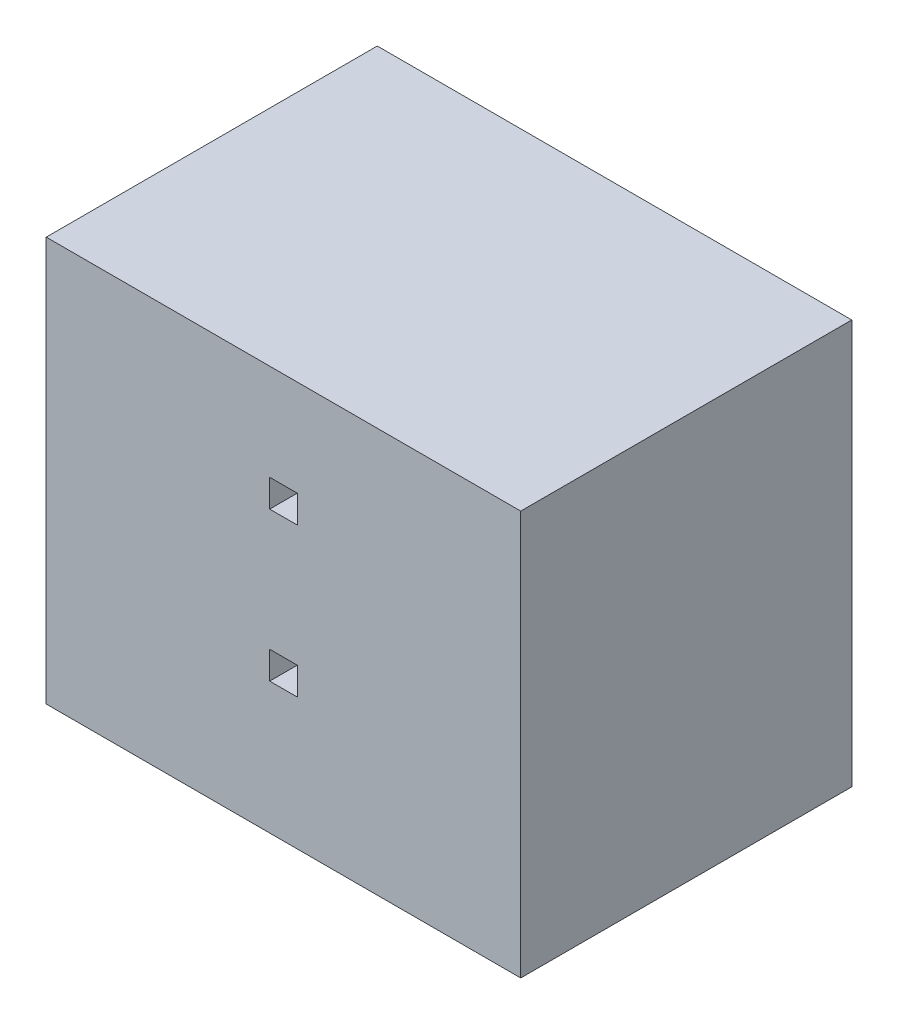
ISO-10303-21;
HEADER;
FILE_DESCRIPTION(('STEP AP214'),'2;1');
FILE_NAME('part.step','',(''),(''),'','','');
FILE_SCHEMA(('AUTOMOTIVE_DESIGN { 1 0 10303 214 1 1 1 1 }'));
ENDSEC;
DATA;
#1=APPLICATION_CONTEXT('core data for automotive mechanical design processes');
#2=APPLICATION_PROTOCOL_DEFINITION('international standard','automotive_design',2000,#1);
#3=PRODUCT_CONTEXT('',#1,'mechanical');
#4=PRODUCT('Part','Part','',(#3));
#5=PRODUCT_RELATED_PRODUCT_CATEGORY('part','',(#4));
#6=PRODUCT_DEFINITION_FORMATION('','',#4);
#7=PRODUCT_DEFINITION_CONTEXT('part definition',#1,'design');
#8=PRODUCT_DEFINITION('design','',#6,#7);
#9=PRODUCT_DEFINITION_SHAPE('','',#8);
#10=(LENGTH_UNIT() NAMED_UNIT(*) SI_UNIT(.MILLI.,.METRE.));
#11=(NAMED_UNIT(*) PLANE_ANGLE_UNIT() SI_UNIT($,.RADIAN.));
#12=(NAMED_UNIT(*) SI_UNIT($,.STERADIAN.) SOLID_ANGLE_UNIT());
#13=UNCERTAINTY_MEASURE_WITH_UNIT(LENGTH_MEASURE(1.E-05),#10,'distance_accuracy_value','');
#14=(GEOMETRIC_REPRESENTATION_CONTEXT(3) GLOBAL_UNCERTAINTY_ASSIGNED_CONTEXT((#13)) GLOBAL_UNIT_ASSIGNED_CONTEXT((#10,
#11,#12)) REPRESENTATION_CONTEXT('',''));
#15=CARTESIAN_POINT('',(0.,0.,0.));
#16=DIRECTION('',(0.,0.,1.));
#17=DIRECTION('',(1.,0.,0.));
#18=AXIS2_PLACEMENT_3D('',#15,#16,#17);
#19=CARTESIAN_POINT('',(0.,0.,200.));
#20=DIRECTION('',(0.,0.,1.));
#21=DIRECTION('',(1.,0.,0.));
#22=AXIS2_PLACEMENT_3D('',#19,#20,#21);
#23=PLANE('',#22);
#24=DIRECTION('',(-1.,0.,0.));
#25=VECTOR('',#24,1.);
#26=CARTESIAN_POINT('',(0.,14.,200.));
#27=LINE('',#26,#25);
#28=CARTESIAN_POINT('',(2.5,14.,200.));
#29=VERTEX_POINT('',#28);
#30=CARTESIAN_POINT('',(-2.5,14.,200.));
#31=VERTEX_POINT('',#30);
#32=EDGE_CURVE('E245',#29,#31,#27,.T.);
#33=ORIENTED_EDGE('',*,*,#32,.T.);
#34=DIRECTION('',(0.,-1.,0.));
#35=VECTOR('',#34,1.);
#36=CARTESIAN_POINT('',(-2.5,0.,200.));
#37=LINE('',#36,#35);
#38=CARTESIAN_POINT('',(-2.5,9.,200.));
#39=VERTEX_POINT('',#38);
#40=EDGE_CURVE('E249',#31,#39,#37,.T.);
#41=ORIENTED_EDGE('',*,*,#40,.T.);
#42=DIRECTION('',(1.,0.,0.));
#43=VECTOR('',#42,1.);
#44=CARTESIAN_POINT('',(0.,9.,200.));
#45=LINE('',#44,#43);
#46=CARTESIAN_POINT('',(2.5,9.,200.));
#47=VERTEX_POINT('',#46);
#48=EDGE_CURVE('E240',#39,#47,#45,.T.);
#49=ORIENTED_EDGE('',*,*,#48,.T.);
#50=DIRECTION('',(0.,1.,0.));
#51=VECTOR('',#50,1.);
#52=CARTESIAN_POINT('',(2.5,0.,200.));
#53=LINE('',#52,#51);
#54=EDGE_CURVE('E165',#47,#29,#53,.T.);
#55=ORIENTED_EDGE('',*,*,#54,.T.);
#56=EDGE_LOOP('',(#33,#41,#49,#55));
#57=FACE_BOUND('',#56,.T.);
#58=DIRECTION('',(1.,0.,0.));
#59=VECTOR('',#58,1.);
#60=CARTESIAN_POINT('',(0.,-18.,200.));
#61=LINE('',#60,#59);
#62=CARTESIAN_POINT('',(-2.5,-18.,200.));
#63=VERTEX_POINT('',#62);
#64=CARTESIAN_POINT('',(2.5,-18.,200.));
#65=VERTEX_POINT('',#64);
#66=EDGE_CURVE('E232',#63,#65,#61,.T.);
#67=ORIENTED_EDGE('',*,*,#66,.T.);
#68=DIRECTION('',(0.,1.,0.));
#69=VECTOR('',#68,1.);
#70=CARTESIAN_POINT('',(2.5,0.,200.));
#71=LINE('',#70,#69);
#72=CARTESIAN_POINT('',(2.5,-13.,200.));
#73=VERTEX_POINT('',#72);
#74=EDGE_CURVE('E236',#65,#73,#71,.T.);
#75=ORIENTED_EDGE('',*,*,#74,.T.);
#76=DIRECTION('',(-1.,0.,0.));
#77=VECTOR('',#76,1.);
#78=CARTESIAN_POINT('',(0.,-13.,200.));
#79=LINE('',#78,#77);
#80=CARTESIAN_POINT('',(-2.5,-13.,200.));
#81=VERTEX_POINT('',#80);
#82=EDGE_CURVE('E194',#73,#81,#79,.T.);
#83=ORIENTED_EDGE('',*,*,#82,.T.);
#84=DIRECTION('',(0.,-1.,0.));
#85=VECTOR('',#84,1.);
#86=CARTESIAN_POINT('',(-2.5,0.,200.));
#87=LINE('',#86,#85);
#88=EDGE_CURVE('E228',#81,#63,#87,.T.);
#89=ORIENTED_EDGE('',*,*,#88,.T.);
#90=EDGE_LOOP('',(#67,#75,#83,#89));
#91=FACE_BOUND('',#90,.T.);
#92=DIRECTION('',(0.,1.,0.));
#93=VECTOR('',#92,1.);
#94=CARTESIAN_POINT('',(-38.,26.4407661527358,200.));
#95=LINE('',#94,#93);
#96=CARTESIAN_POINT('',(-38.,-36.8493069972775,200.));
#97=VERTEX_POINT('',#96);
#98=CARTESIAN_POINT('',(-38.,26.4407661527358,200.));
#99=VERTEX_POINT('',#98);
#100=EDGE_CURVE('E330',#97,#99,#95,.T.);
#101=ORIENTED_EDGE('',*,*,#100,.T.);
#102=DIRECTION('',(1.,0.,0.));
#103=VECTOR('',#102,1.);
#104=CARTESIAN_POINT('',(-35.8835144409682,26.4407661527358,200.));
#105=LINE('',#104,#103);
#106=CARTESIAN_POINT('',(38.,26.4407661527358,200.));
#107=VERTEX_POINT('',#106);
#108=EDGE_CURVE('E11',#99,#107,#105,.T.);
#109=ORIENTED_EDGE('',*,*,#108,.T.);
#110=DIRECTION('',(0.,-1.,0.));
#111=VECTOR('',#110,1.);
#112=CARTESIAN_POINT('',(38.,-36.8493069972775,200.));
#113=LINE('',#112,#111);
#114=CARTESIAN_POINT('',(38.,-36.8493069972776,200.));
#115=VERTEX_POINT('',#114);
#116=EDGE_CURVE('E48',#107,#115,#113,.T.);
#117=ORIENTED_EDGE('',*,*,#116,.T.);
#118=DIRECTION('',(-1.,0.,0.));
#119=VECTOR('',#118,1.);
#120=CARTESIAN_POINT('',(-35.8835144409682,-36.8493069972775,200.));
#121=LINE('',#120,#119);
#122=EDGE_CURVE('E54',#115,#97,#121,.T.);
#123=ORIENTED_EDGE('',*,*,#122,.T.);
#124=EDGE_LOOP('',(#101,#109,#117,#123));
#125=FACE_BOUND('',#124,.T.);
#126=ADVANCED_FACE('F45',(#57,#91,#125),#23,.F.);
#127=CARTESIAN_POINT('',(-38.,26.4407661527358,160.));
#128=DIRECTION('',(-1.,0.,0.));
#129=DIRECTION('',(0.,0.,1.));
#130=AXIS2_PLACEMENT_3D('',#127,#128,#129);
#131=PLANE('',#130);
#132=DIRECTION('',(0.,0.,1.));
#133=VECTOR('',#132,1.);
#134=CARTESIAN_POINT('',(-38.,26.4407661527358,160.));
#135=LINE('',#134,#133);
#136=CARTESIAN_POINT('',(-38.,26.4407661527358,160.));
#137=VERTEX_POINT('',#136);
#138=EDGE_CURVE('E270',#137,#99,#135,.T.);
#139=ORIENTED_EDGE('',*,*,#138,.T.);
#140=ORIENTED_EDGE('',*,*,#100,.F.);
#141=DIRECTION('',(0.,0.,1.));
#142=VECTOR('',#141,1.);
#143=CARTESIAN_POINT('',(-38.,-36.8493069972776,160.));
#144=LINE('',#143,#142);
#145=CARTESIAN_POINT('',(-38.,-36.8493069972776,160.));
#146=VERTEX_POINT('',#145);
#147=EDGE_CURVE('E269',#146,#97,#144,.T.);
#148=ORIENTED_EDGE('',*,*,#147,.F.);
#149=DIRECTION('',(0.,-1.,0.));
#150=VECTOR('',#149,1.);
#151=CARTESIAN_POINT('',(-38.,26.4407661527358,160.));
#152=LINE('',#151,#150);
#153=EDGE_CURVE('E253',#137,#146,#152,.T.);
#154=ORIENTED_EDGE('',*,*,#153,.F.);
#155=EDGE_LOOP('',(#139,#140,#148,#154));
#156=FACE_BOUND('',#155,.T.);
#157=ADVANCED_FACE('F351',(#156),#131,.F.);
#158=CARTESIAN_POINT('',(-38.,26.4407661527358,160.));
#159=DIRECTION('',(0.,1.,0.));
#160=DIRECTION('',(0.,0.,1.));
#161=AXIS2_PLACEMENT_3D('',#158,#159,#160);
#162=PLANE('',#161);
#163=DIRECTION('',(0.,0.,1.));
#164=VECTOR('',#163,1.);
#165=CARTESIAN_POINT('',(38.,26.4407661527358,160.));
#166=LINE('',#165,#164);
#167=CARTESIAN_POINT('',(38.,26.4407661527358,160.));
#168=VERTEX_POINT('',#167);
#169=EDGE_CURVE('E275',#168,#107,#166,.T.);
#170=ORIENTED_EDGE('',*,*,#169,.T.);
#171=ORIENTED_EDGE('',*,*,#108,.F.);
#172=ORIENTED_EDGE('',*,*,#138,.F.);
#173=DIRECTION('',(-1.,0.,0.));
#174=VECTOR('',#173,1.);
#175=CARTESIAN_POINT('',(-38.,26.4407661527358,160.));
#176=LINE('',#175,#174);
#177=EDGE_CURVE('E265',#168,#137,#176,.T.);
#178=ORIENTED_EDGE('',*,*,#177,.F.);
#179=EDGE_LOOP('',(#170,#171,#172,#178));
#180=FACE_BOUND('',#179,.T.);
#181=ADVANCED_FACE('F342',(#180),#162,.F.);
#182=CARTESIAN_POINT('',(38.,26.4407661527358,160.));
#183=DIRECTION('',(1.,0.,0.));
#184=DIRECTION('',(0.,0.,-1.));
#185=AXIS2_PLACEMENT_3D('',#182,#183,#184);
#186=PLANE('',#185);
#187=DIRECTION('',(0.,0.,1.));
#188=VECTOR('',#187,1.);
#189=CARTESIAN_POINT('',(38.,-36.8493069972776,160.));
#190=LINE('',#189,#188);
#191=CARTESIAN_POINT('',(38.,-36.8493069972776,160.));
#192=VERTEX_POINT('',#191);
#193=EDGE_CURVE('E279',#192,#115,#190,.T.);
#194=ORIENTED_EDGE('',*,*,#193,.T.);
#195=ORIENTED_EDGE('',*,*,#116,.F.);
#196=ORIENTED_EDGE('',*,*,#169,.F.);
#197=DIRECTION('',(0.,1.,0.));
#198=VECTOR('',#197,1.);
#199=CARTESIAN_POINT('',(38.,26.4407661527358,160.));
#200=LINE('',#199,#198);
#201=EDGE_CURVE('E261',#192,#168,#200,.T.);
#202=ORIENTED_EDGE('',*,*,#201,.F.);
#203=EDGE_LOOP('',(#194,#195,#196,#202));
#204=FACE_BOUND('',#203,.T.);
#205=ADVANCED_FACE('F338',(#204),#186,.F.);
#206=CARTESIAN_POINT('',(-38.,-36.8493069972776,160.));
#207=DIRECTION('',(0.,-1.,0.));
#208=DIRECTION('',(0.,0.,-1.));
#209=AXIS2_PLACEMENT_3D('',#206,#207,#208);
#210=PLANE('',#209);
#211=ORIENTED_EDGE('',*,*,#147,.T.);
#212=ORIENTED_EDGE('',*,*,#122,.F.);
#213=ORIENTED_EDGE('',*,*,#193,.F.);
#214=DIRECTION('',(1.,0.,0.));
#215=VECTOR('',#214,1.);
#216=CARTESIAN_POINT('',(-38.,-36.8493069972776,160.));
#217=LINE('',#216,#215);
#218=EDGE_CURVE('E257',#146,#192,#217,.T.);
#219=ORIENTED_EDGE('',*,*,#218,.F.);
#220=EDGE_LOOP('',(#211,#212,#213,#219));
#221=FACE_BOUND('',#220,.T.);
#222=ADVANCED_FACE('F349',(#221),#210,.F.);
#223=CARTESIAN_POINT('',(43.,-41.8493069972775,160.));
#224=DIRECTION('',(1.,0.,0.));
#225=DIRECTION('',(0.,0.,-1.));
#226=AXIS2_PLACEMENT_3D('',#223,#224,#225);
#227=PLANE('',#226);
#228=DIRECTION('',(0.,1.,0.));
#229=VECTOR('',#228,1.);
#230=CARTESIAN_POINT('',(43.,-41.8493069972775,220.));
#231=LINE('',#230,#229);
#232=CARTESIAN_POINT('',(43.,-41.8493069972775,220.));
#233=VERTEX_POINT('',#232);
#234=CARTESIAN_POINT('',(43.,31.4407661527358,220.));
#235=VERTEX_POINT('',#234);
#236=EDGE_CURVE('E274',#233,#235,#231,.T.);
#237=ORIENTED_EDGE('',*,*,#236,.F.);
#238=DIRECTION('',(0.,0.,1.));
#239=VECTOR('',#238,1.);
#240=CARTESIAN_POINT('',(43.,-41.8493069972775,160.));
#241=LINE('',#240,#239);
#242=CARTESIAN_POINT('',(43.,-41.8493069972775,160.));
#243=VERTEX_POINT('',#242);
#244=EDGE_CURVE('E317',#243,#233,#241,.T.);
#245=ORIENTED_EDGE('',*,*,#244,.F.);
#246=DIRECTION('',(0.,1.,0.));
#247=VECTOR('',#246,1.);
#248=CARTESIAN_POINT('',(43.,-41.8493069972775,160.));
#249=LINE('',#248,#247);
#250=CARTESIAN_POINT('',(43.,31.4407661527358,160.));
#251=VERTEX_POINT('',#250);
#252=EDGE_CURVE('E285',#243,#251,#249,.T.);
#253=ORIENTED_EDGE('',*,*,#252,.T.);
#254=DIRECTION('',(0.,0.,1.));
#255=VECTOR('',#254,1.);
#256=CARTESIAN_POINT('',(43.,31.4407661527358,160.));
#257=LINE('',#256,#255);
#258=EDGE_CURVE('E302',#251,#235,#257,.T.);
#259=ORIENTED_EDGE('',*,*,#258,.T.);
#260=EDGE_LOOP('',(#237,#245,#253,#259));
#261=FACE_BOUND('',#260,.T.);
#262=ADVANCED_FACE('F370',(#261),#227,.T.);
#263=CARTESIAN_POINT('',(43.,-41.8493069972775,160.));
#264=DIRECTION('',(0.,-1.,0.));
#265=DIRECTION('',(1.,0.,0.));
#266=AXIS2_PLACEMENT_3D('',#263,#264,#265);
#267=PLANE('',#266);
#268=DIRECTION('',(1.,0.,0.));
#269=VECTOR('',#268,1.);
#270=CARTESIAN_POINT('',(43.,-41.8493069972775,220.));
#271=LINE('',#270,#269);
#272=CARTESIAN_POINT('',(-43.,-41.8493069972776,220.));
#273=VERTEX_POINT('',#272);
#274=EDGE_CURVE('E290',#273,#233,#271,.T.);
#275=ORIENTED_EDGE('',*,*,#274,.F.);
#276=DIRECTION('',(0.,0.,1.));
#277=VECTOR('',#276,1.);
#278=CARTESIAN_POINT('',(-43.,-41.8493069972776,160.));
#279=LINE('',#278,#277);
#280=CARTESIAN_POINT('',(-43.,-41.8493069972776,160.));
#281=VERTEX_POINT('',#280);
#282=EDGE_CURVE('E320',#281,#273,#279,.T.);
#283=ORIENTED_EDGE('',*,*,#282,.F.);
#284=DIRECTION('',(1.,0.,0.));
#285=VECTOR('',#284,1.);
#286=CARTESIAN_POINT('',(43.,-41.8493069972775,160.));
#287=LINE('',#286,#285);
#288=EDGE_CURVE('E298',#281,#243,#287,.T.);
#289=ORIENTED_EDGE('',*,*,#288,.T.);
#290=ORIENTED_EDGE('',*,*,#244,.T.);
#291=EDGE_LOOP('',(#275,#283,#289,#290));
#292=FACE_BOUND('',#291,.T.);
#293=ADVANCED_FACE('F366',(#292),#267,.T.);
#294=CARTESIAN_POINT('',(-43.,-41.8493069972776,160.));
#295=DIRECTION('',(-1.,0.,0.));
#296=DIRECTION('',(0.,0.,1.));
#297=AXIS2_PLACEMENT_3D('',#294,#295,#296);
#298=PLANE('',#297);
#299=DIRECTION('',(0.,-1.,0.));
#300=VECTOR('',#299,1.);
#301=CARTESIAN_POINT('',(-43.,-41.8493069972776,220.));
#302=LINE('',#301,#300);
#303=CARTESIAN_POINT('',(-43.,31.4407661527358,220.));
#304=VERTEX_POINT('',#303);
#305=EDGE_CURVE('E310',#304,#273,#302,.T.);
#306=ORIENTED_EDGE('',*,*,#305,.F.);
#307=DIRECTION('',(0.,0.,1.));
#308=VECTOR('',#307,1.);
#309=CARTESIAN_POINT('',(-43.,31.4407661527358,160.));
#310=LINE('',#309,#308);
#311=CARTESIAN_POINT('',(-43.,31.4407661527358,160.));
#312=VERTEX_POINT('',#311);
#313=EDGE_CURVE('E323',#312,#304,#310,.T.);
#314=ORIENTED_EDGE('',*,*,#313,.F.);
#315=DIRECTION('',(0.,-1.,0.));
#316=VECTOR('',#315,1.);
#317=CARTESIAN_POINT('',(-43.,-41.8493069972776,160.));
#318=LINE('',#317,#316);
#319=EDGE_CURVE('E294',#312,#281,#318,.T.);
#320=ORIENTED_EDGE('',*,*,#319,.T.);
#321=ORIENTED_EDGE('',*,*,#282,.T.);
#322=EDGE_LOOP('',(#306,#314,#320,#321));
#323=FACE_BOUND('',#322,.T.);
#324=ADVANCED_FACE('F369',(#323),#298,.T.);
#325=CARTESIAN_POINT('',(43.,31.4407661527358,160.));
#326=DIRECTION('',(0.,1.,0.));
#327=DIRECTION('',(-1.,0.,0.));
#328=AXIS2_PLACEMENT_3D('',#325,#326,#327);
#329=PLANE('',#328);
#330=DIRECTION('',(-1.,0.,0.));
#331=VECTOR('',#330,1.);
#332=CARTESIAN_POINT('',(43.,31.4407661527358,220.));
#333=LINE('',#332,#331);
#334=EDGE_CURVE('E306',#235,#304,#333,.T.);
#335=ORIENTED_EDGE('',*,*,#334,.F.);
#336=ORIENTED_EDGE('',*,*,#258,.F.);
#337=DIRECTION('',(-1.,0.,0.));
#338=VECTOR('',#337,1.);
#339=CARTESIAN_POINT('',(43.,31.4407661527358,160.));
#340=LINE('',#339,#338);
#341=EDGE_CURVE('E289',#251,#312,#340,.T.);
#342=ORIENTED_EDGE('',*,*,#341,.T.);
#343=ORIENTED_EDGE('',*,*,#313,.T.);
#344=EDGE_LOOP('',(#335,#336,#342,#343));
#345=FACE_BOUND('',#344,.T.);
#346=ADVANCED_FACE('F365',(#345),#329,.T.);
#347=CARTESIAN_POINT('',(0.,0.,160.));
#348=DIRECTION('',(0.,0.,1.));
#349=DIRECTION('',(1.,0.,0.));
#350=AXIS2_PLACEMENT_3D('',#347,#348,#349);
#351=PLANE('',#350);
#352=ORIENTED_EDGE('',*,*,#177,.T.);
#353=ORIENTED_EDGE('',*,*,#153,.T.);
#354=ORIENTED_EDGE('',*,*,#218,.T.);
#355=ORIENTED_EDGE('',*,*,#201,.T.);
#356=EDGE_LOOP('',(#352,#353,#354,#355));
#357=FACE_BOUND('',#356,.T.);
#358=ORIENTED_EDGE('',*,*,#252,.F.);
#359=ORIENTED_EDGE('',*,*,#288,.F.);
#360=ORIENTED_EDGE('',*,*,#319,.F.);
#361=ORIENTED_EDGE('',*,*,#341,.F.);
#362=EDGE_LOOP('',(#358,#359,#360,#361));
#363=FACE_BOUND('',#362,.T.);
#364=ADVANCED_FACE('F345',(#357,#363),#351,.F.);
#365=CARTESIAN_POINT('',(166.714521290394,75.7158218217472,220.));
#366=DIRECTION('',(0.,0.,-1.));
#367=DIRECTION('',(0.,1.,0.));
#368=AXIS2_PLACEMENT_3D('',#365,#366,#367);
#369=PLANE('',#368);
#370=DIRECTION('',(1.,0.,0.));
#371=VECTOR('',#370,1.);
#372=CARTESIAN_POINT('',(-2.5,9.,220.));
#373=LINE('',#372,#371);
#374=CARTESIAN_POINT('',(-2.5,8.99999999999999,220.));
#375=VERTEX_POINT('',#374);
#376=CARTESIAN_POINT('',(2.5,9.,220.));
#377=VERTEX_POINT('',#376);
#378=EDGE_CURVE('E173',#375,#377,#373,.T.);
#379=ORIENTED_EDGE('',*,*,#378,.F.);
#380=DIRECTION('',(0.,-1.,0.));
#381=VECTOR('',#380,1.);
#382=CARTESIAN_POINT('',(-2.5,14.,220.));
#383=LINE('',#382,#381);
#384=CARTESIAN_POINT('',(-2.5,14.,220.));
#385=VERTEX_POINT('',#384);
#386=EDGE_CURVE('E179',#385,#375,#383,.T.);
#387=ORIENTED_EDGE('',*,*,#386,.F.);
#388=DIRECTION('',(-1.,0.,0.));
#389=VECTOR('',#388,1.);
#390=CARTESIAN_POINT('',(-2.5,14.,220.));
#391=LINE('',#390,#389);
#392=CARTESIAN_POINT('',(2.5,14.,220.));
#393=VERTEX_POINT('',#392);
#394=EDGE_CURVE('E184',#393,#385,#391,.T.);
#395=ORIENTED_EDGE('',*,*,#394,.F.);
#396=DIRECTION('',(0.,1.,0.));
#397=VECTOR('',#396,1.);
#398=CARTESIAN_POINT('',(2.5,14.,220.));
#399=LINE('',#398,#397);
#400=EDGE_CURVE('E162',#377,#393,#399,.T.);
#401=ORIENTED_EDGE('',*,*,#400,.F.);
#402=EDGE_LOOP('',(#379,#387,#395,#401));
#403=FACE_BOUND('',#402,.T.);
#404=DIRECTION('',(-1.,0.,0.));
#405=VECTOR('',#404,1.);
#406=CARTESIAN_POINT('',(2.5,-13.,220.));
#407=LINE('',#406,#405);
#408=CARTESIAN_POINT('',(2.5,-13.,220.));
#409=VERTEX_POINT('',#408);
#410=CARTESIAN_POINT('',(-2.5,-13.,220.));
#411=VERTEX_POINT('',#410);
#412=EDGE_CURVE('E219',#409,#411,#407,.T.);
#413=ORIENTED_EDGE('',*,*,#412,.F.);
#414=DIRECTION('',(0.,1.,0.));
#415=VECTOR('',#414,1.);
#416=CARTESIAN_POINT('',(2.5,-13.,220.));
#417=LINE('',#416,#415);
#418=CARTESIAN_POINT('',(2.5,-18.,220.));
#419=VERTEX_POINT('',#418);
#420=EDGE_CURVE('E222',#419,#409,#417,.T.);
#421=ORIENTED_EDGE('',*,*,#420,.F.);
#422=DIRECTION('',(1.,0.,0.));
#423=VECTOR('',#422,1.);
#424=CARTESIAN_POINT('',(2.5,-18.,220.));
#425=LINE('',#424,#423);
#426=CARTESIAN_POINT('',(-2.5,-18.,220.));
#427=VERTEX_POINT('',#426);
#428=EDGE_CURVE('E203',#427,#419,#425,.T.);
#429=ORIENTED_EDGE('',*,*,#428,.F.);
#430=DIRECTION('',(0.,-1.,0.));
#431=VECTOR('',#430,1.);
#432=CARTESIAN_POINT('',(-2.5,-13.,220.));
#433=LINE('',#432,#431);
#434=EDGE_CURVE('E215',#411,#427,#433,.T.);
#435=ORIENTED_EDGE('',*,*,#434,.F.);
#436=EDGE_LOOP('',(#413,#421,#429,#435));
#437=FACE_BOUND('',#436,.T.);
#438=ORIENTED_EDGE('',*,*,#236,.T.);
#439=ORIENTED_EDGE('',*,*,#334,.T.);
#440=ORIENTED_EDGE('',*,*,#305,.T.);
#441=ORIENTED_EDGE('',*,*,#274,.T.);
#442=EDGE_LOOP('',(#438,#439,#440,#441));
#443=FACE_BOUND('',#442,.T.);
#444=ADVANCED_FACE('F181',(#403,#437,#443),#369,.F.);
#445=CARTESIAN_POINT('',(2.5,-13.,170.));
#446=DIRECTION('',(1.,0.,0.));
#447=DIRECTION('',(0.,0.,-1.));
#448=AXIS2_PLACEMENT_3D('',#445,#446,#447);
#449=PLANE('',#448);
#450=DIRECTION('',(0.,0.,1.));
#451=VECTOR('',#450,1.);
#452=CARTESIAN_POINT('',(2.5,-18.,170.));
#453=LINE('',#452,#451);
#454=EDGE_CURVE('E209',#65,#419,#453,.T.);
#455=ORIENTED_EDGE('',*,*,#454,.T.);
#456=ORIENTED_EDGE('',*,*,#420,.T.);
#457=DIRECTION('',(0.,0.,1.));
#458=VECTOR('',#457,1.);
#459=CARTESIAN_POINT('',(2.5,-13.,170.));
#460=LINE('',#459,#458);
#461=EDGE_CURVE('E199',#73,#409,#460,.T.);
#462=ORIENTED_EDGE('',*,*,#461,.F.);
#463=ORIENTED_EDGE('',*,*,#74,.F.);
#464=EDGE_LOOP('',(#455,#456,#462,#463));
#465=FACE_BOUND('',#464,.T.);
#466=ADVANCED_FACE('F381',(#465),#449,.F.);
#467=CARTESIAN_POINT('',(2.5,-18.,170.));
#468=DIRECTION('',(0.,-1.,0.));
#469=DIRECTION('',(0.,0.,-1.));
#470=AXIS2_PLACEMENT_3D('',#467,#468,#469);
#471=PLANE('',#470);
#472=DIRECTION('',(0.,0.,1.));
#473=VECTOR('',#472,1.);
#474=CARTESIAN_POINT('',(-2.5,-18.,170.));
#475=LINE('',#474,#473);
#476=EDGE_CURVE('E206',#63,#427,#475,.T.);
#477=ORIENTED_EDGE('',*,*,#476,.T.);
#478=ORIENTED_EDGE('',*,*,#428,.T.);
#479=ORIENTED_EDGE('',*,*,#454,.F.);
#480=ORIENTED_EDGE('',*,*,#66,.F.);
#481=EDGE_LOOP('',(#477,#478,#479,#480));
#482=FACE_BOUND('',#481,.T.);
#483=ADVANCED_FACE('F385',(#482),#471,.F.);
#484=CARTESIAN_POINT('',(-2.5,-13.,170.));
#485=DIRECTION('',(-1.,0.,0.));
#486=DIRECTION('',(0.,0.,1.));
#487=AXIS2_PLACEMENT_3D('',#484,#485,#486);
#488=PLANE('',#487);
#489=DIRECTION('',(0.,0.,1.));
#490=VECTOR('',#489,1.);
#491=CARTESIAN_POINT('',(-2.5,-13.,170.));
#492=LINE('',#491,#490);
#493=EDGE_CURVE('E70',#81,#411,#492,.T.);
#494=ORIENTED_EDGE('',*,*,#493,.T.);
#495=ORIENTED_EDGE('',*,*,#434,.T.);
#496=ORIENTED_EDGE('',*,*,#476,.F.);
#497=ORIENTED_EDGE('',*,*,#88,.F.);
#498=EDGE_LOOP('',(#494,#495,#496,#497));
#499=FACE_BOUND('',#498,.T.);
#500=ADVANCED_FACE('F391',(#499),#488,.F.);
#501=CARTESIAN_POINT('',(2.5,-13.,170.));
#502=DIRECTION('',(0.,1.,0.));
#503=DIRECTION('',(0.,0.,1.));
#504=AXIS2_PLACEMENT_3D('',#501,#502,#503);
#505=PLANE('',#504);
#506=ORIENTED_EDGE('',*,*,#461,.T.);
#507=ORIENTED_EDGE('',*,*,#412,.T.);
#508=ORIENTED_EDGE('',*,*,#493,.F.);
#509=ORIENTED_EDGE('',*,*,#82,.F.);
#510=EDGE_LOOP('',(#506,#507,#508,#509));
#511=FACE_BOUND('',#510,.T.);
#512=ADVANCED_FACE('F398',(#511),#505,.F.);
#513=CARTESIAN_POINT('',(-2.5,14.,170.));
#514=DIRECTION('',(-1.,0.,0.));
#515=DIRECTION('',(0.,0.,1.));
#516=AXIS2_PLACEMENT_3D('',#513,#514,#515);
#517=PLANE('',#516);
#518=DIRECTION('',(0.,0.,1.));
#519=VECTOR('',#518,1.);
#520=CARTESIAN_POINT('',(-2.5,14.,170.));
#521=LINE('',#520,#519);
#522=EDGE_CURVE('E191',#31,#385,#521,.T.);
#523=ORIENTED_EDGE('',*,*,#522,.T.);
#524=ORIENTED_EDGE('',*,*,#386,.T.);
#525=DIRECTION('',(0.,0.,1.));
#526=VECTOR('',#525,1.);
#527=CARTESIAN_POINT('',(-2.5,9.,170.));
#528=LINE('',#527,#526);
#529=EDGE_CURVE('E169',#39,#375,#528,.T.);
#530=ORIENTED_EDGE('',*,*,#529,.F.);
#531=ORIENTED_EDGE('',*,*,#40,.F.);
#532=EDGE_LOOP('',(#523,#524,#530,#531));
#533=FACE_BOUND('',#532,.T.);
#534=ADVANCED_FACE('F396',(#533),#517,.F.);
#535=CARTESIAN_POINT('',(-2.5,14.,170.));
#536=DIRECTION('',(0.,1.,0.));
#537=DIRECTION('',(0.,0.,1.));
#538=AXIS2_PLACEMENT_3D('',#535,#536,#537);
#539=PLANE('',#538);
#540=DIRECTION('',(0.,0.,1.));
#541=VECTOR('',#540,1.);
#542=CARTESIAN_POINT('',(2.5,14.,170.));
#543=LINE('',#542,#541);
#544=EDGE_CURVE('E168',#29,#393,#543,.T.);
#545=ORIENTED_EDGE('',*,*,#544,.T.);
#546=ORIENTED_EDGE('',*,*,#394,.T.);
#547=ORIENTED_EDGE('',*,*,#522,.F.);
#548=ORIENTED_EDGE('',*,*,#32,.F.);
#549=EDGE_LOOP('',(#545,#546,#547,#548));
#550=FACE_BOUND('',#549,.T.);
#551=ADVANCED_FACE('F477',(#550),#539,.F.);
#552=CARTESIAN_POINT('',(2.5,14.,170.));
#553=DIRECTION('',(1.,0.,0.));
#554=DIRECTION('',(0.,0.,-1.));
#555=AXIS2_PLACEMENT_3D('',#552,#553,#554);
#556=PLANE('',#555);
#557=DIRECTION('',(0.,0.,1.));
#558=VECTOR('',#557,1.);
#559=CARTESIAN_POINT('',(2.5,9.,170.));
#560=LINE('',#559,#558);
#561=EDGE_CURVE('E62',#47,#377,#560,.T.);
#562=ORIENTED_EDGE('',*,*,#561,.T.);
#563=ORIENTED_EDGE('',*,*,#400,.T.);
#564=ORIENTED_EDGE('',*,*,#544,.F.);
#565=ORIENTED_EDGE('',*,*,#54,.F.);
#566=EDGE_LOOP('',(#562,#563,#564,#565));
#567=FACE_BOUND('',#566,.T.);
#568=ADVANCED_FACE('F159',(#567),#556,.F.);
#569=CARTESIAN_POINT('',(-2.5,9.,170.));
#570=DIRECTION('',(0.,-1.,0.));
#571=DIRECTION('',(0.,0.,-1.));
#572=AXIS2_PLACEMENT_3D('',#569,#570,#571);
#573=PLANE('',#572);
#574=ORIENTED_EDGE('',*,*,#529,.T.);
#575=ORIENTED_EDGE('',*,*,#378,.T.);
#576=ORIENTED_EDGE('',*,*,#561,.F.);
#577=ORIENTED_EDGE('',*,*,#48,.F.);
#578=EDGE_LOOP('',(#574,#575,#576,#577));
#579=FACE_BOUND('',#578,.T.);
#580=ADVANCED_FACE('F174',(#579),#573,.F.);
#581=CLOSED_SHELL('',(#126,#157,#181,#205,#222,#262,#293,#324,#346,#364,#444,#466,#483,#500,
#512,#534,#551,#568,#580));
#582=MANIFOLD_SOLID_BREP('B2',#581);
#583=ADVANCED_BREP_SHAPE_REPRESENTATION('',(#18,#582),#14);
#584=SHAPE_DEFINITION_REPRESENTATION(#9,#583);
ENDSEC;
END-ISO-10303-21;
